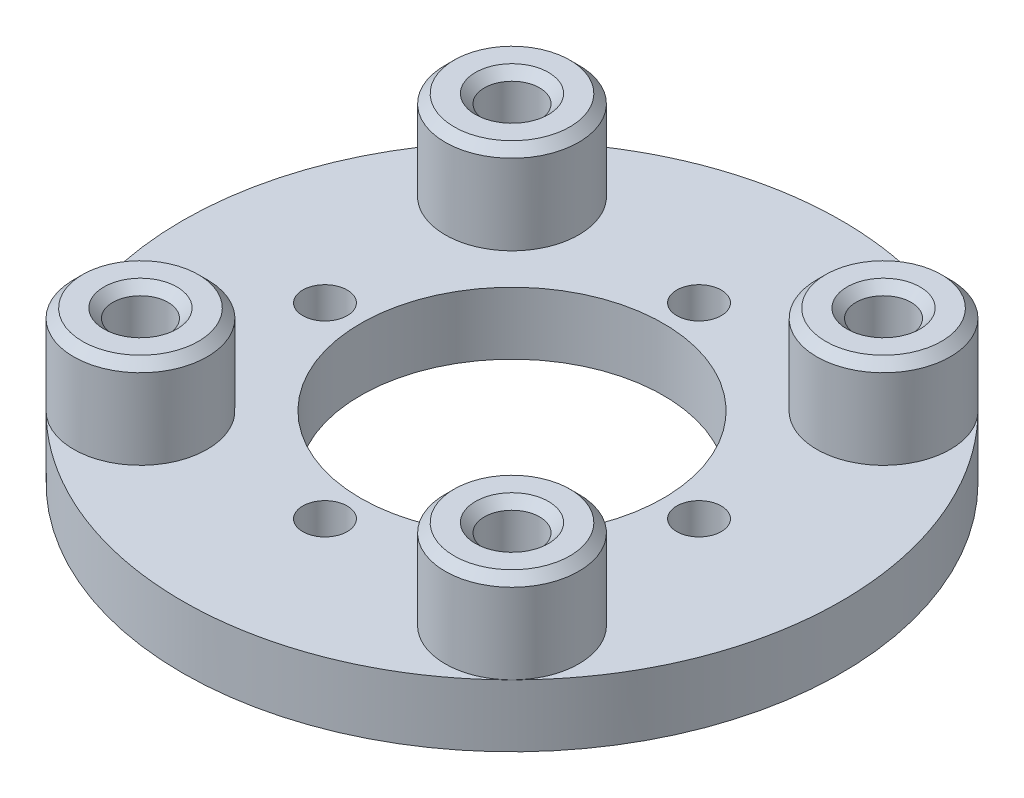
ISO-10303-21;
HEADER;
FILE_DESCRIPTION(('STEP AP214'),'2;1');
FILE_NAME('part.step','',(''),(''),'','','');
FILE_SCHEMA(('AUTOMOTIVE_DESIGN { 1 0 10303 214 1 1 1 1 }'));
ENDSEC;
DATA;
#1=APPLICATION_CONTEXT('core data for automotive mechanical design processes');
#2=APPLICATION_PROTOCOL_DEFINITION('international standard','automotive_design',2000,#1);
#3=PRODUCT_CONTEXT('',#1,'mechanical');
#4=PRODUCT('Part','Part','',(#3));
#5=PRODUCT_RELATED_PRODUCT_CATEGORY('part','',(#4));
#6=PRODUCT_DEFINITION_FORMATION('','',#4);
#7=PRODUCT_DEFINITION_CONTEXT('part definition',#1,'design');
#8=PRODUCT_DEFINITION('design','',#6,#7);
#9=PRODUCT_DEFINITION_SHAPE('','',#8);
#10=(LENGTH_UNIT() NAMED_UNIT(*) SI_UNIT(.MILLI.,.METRE.));
#11=(NAMED_UNIT(*) PLANE_ANGLE_UNIT() SI_UNIT($,.RADIAN.));
#12=(NAMED_UNIT(*) SI_UNIT($,.STERADIAN.) SOLID_ANGLE_UNIT());
#13=UNCERTAINTY_MEASURE_WITH_UNIT(LENGTH_MEASURE(1.E-05),#10,'distance_accuracy_value','');
#14=(GEOMETRIC_REPRESENTATION_CONTEXT(3) GLOBAL_UNCERTAINTY_ASSIGNED_CONTEXT((#13)) GLOBAL_UNIT_ASSIGNED_CONTEXT((#10,
#11,#12)) REPRESENTATION_CONTEXT('',''));
#15=CARTESIAN_POINT('',(0.,0.,0.));
#16=DIRECTION('',(0.,0.,1.));
#17=DIRECTION('',(1.,0.,0.));
#18=AXIS2_PLACEMENT_3D('',#15,#16,#17);
#19=CARTESIAN_POINT('',(0.,7.,0.));
#20=DIRECTION('',(0.,1.,0.));
#21=DIRECTION('',(0.,0.,1.));
#22=AXIS2_PLACEMENT_3D('',#19,#20,#21);
#23=PLANE('',#22);
#24=CARTESIAN_POINT('',(-21.,7.,-1.46642216231412E-13));
#25=DIRECTION('',(0.,1.,0.));
#26=DIRECTION('',(0.,0.,1.));
#27=AXIS2_PLACEMENT_3D('',#24,#25,#26);
#28=CIRCLE('',#27,2.5);
#29=CARTESIAN_POINT('',(-21.,7.,2.49999999999985));
#30=VERTEX_POINT('',#29);
#31=EDGE_CURVE('E432',#30,#30,#28,.T.);
#32=ORIENTED_EDGE('',*,*,#31,.F.);
#33=EDGE_LOOP('',(#32));
#34=FACE_BOUND('',#33,.T.);
#35=CARTESIAN_POINT('',(0.,7.,0.));
#36=DIRECTION('',(0.,1.,0.));
#37=DIRECTION('',(0.,0.,1.));
#38=AXIS2_PLACEMENT_3D('',#35,#36,#37);
#39=CIRCLE('',#38,17.);
#40=CARTESIAN_POINT('',(0.,7.,17.));
#41=VERTEX_POINT('',#40);
#42=EDGE_CURVE('E396',#41,#41,#39,.T.);
#43=ORIENTED_EDGE('',*,*,#42,.F.);
#44=EDGE_LOOP('',(#43));
#45=FACE_BOUND('',#44,.T.);
#46=CARTESIAN_POINT('',(0.,7.,0.));
#47=DIRECTION('',(0.,1.,0.));
#48=DIRECTION('',(0.,0.,1.));
#49=AXIS2_PLACEMENT_3D('',#46,#47,#48);
#50=CIRCLE('',#49,37.);
#51=CARTESIAN_POINT('',(26.1629509039023,7.,26.1629509039023));
#52=VERTEX_POINT('',#51);
#53=CARTESIAN_POINT('',(26.1629509039025,7.,-26.162950903902));
#54=VERTEX_POINT('',#53);
#55=EDGE_CURVE('E77',#52,#54,#50,.T.);
#56=ORIENTED_EDGE('',*,*,#55,.T.);
#57=CARTESIAN_POINT('',(20.8596500450034,7.,-20.8596500450029));
#58=DIRECTION('',(0.,1.,0.));
#59=DIRECTION('',(0.,0.,1.));
#60=AXIS2_PLACEMENT_3D('',#57,#58,#59);
#61=CIRCLE('',#60,7.5);
#62=EDGE_CURVE('E48',#54,#54,#61,.T.);
#63=ORIENTED_EDGE('',*,*,#62,.F.);
#64=CARTESIAN_POINT('',(-26.1629509039021,7.,-26.1629509039024));
#65=VERTEX_POINT('',#64);
#66=EDGE_CURVE('E54',#54,#65,#50,.T.);
#67=ORIENTED_EDGE('',*,*,#66,.T.);
#68=CARTESIAN_POINT('',(-20.859650045003,7.,-20.8596500450033));
#69=DIRECTION('',(0.,1.,0.));
#70=DIRECTION('',(0.,0.,1.));
#71=AXIS2_PLACEMENT_3D('',#68,#69,#70);
#72=CIRCLE('',#71,7.5);
#73=EDGE_CURVE('E438',#65,#65,#72,.T.);
#74=ORIENTED_EDGE('',*,*,#73,.F.);
#75=CARTESIAN_POINT('',(-26.1629509039023,7.,26.1629509039022));
#76=VERTEX_POINT('',#75);
#77=EDGE_CURVE('E74',#65,#76,#50,.T.);
#78=ORIENTED_EDGE('',*,*,#77,.T.);
#79=CARTESIAN_POINT('',(-20.8596500450032,7.,20.8596500450031));
#80=DIRECTION('',(0.,1.,0.));
#81=DIRECTION('',(0.,0.,1.));
#82=AXIS2_PLACEMENT_3D('',#79,#80,#81);
#83=CIRCLE('',#82,7.5);
#84=EDGE_CURVE('E71',#76,#76,#83,.T.);
#85=ORIENTED_EDGE('',*,*,#84,.F.);
#86=EDGE_CURVE('E64',#76,#52,#50,.T.);
#87=ORIENTED_EDGE('',*,*,#86,.T.);
#88=CARTESIAN_POINT('',(20.8596500450031,7.,20.8596500450031));
#89=DIRECTION('',(0.,1.,0.));
#90=DIRECTION('',(0.,0.,1.));
#91=AXIS2_PLACEMENT_3D('',#88,#89,#90);
#92=CIRCLE('',#91,7.5);
#93=EDGE_CURVE('E69',#52,#52,#92,.T.);
#94=ORIENTED_EDGE('',*,*,#93,.F.);
#95=EDGE_LOOP('',(#56,#63,#67,#74,#78,#85,#87,#94));
#96=FACE_BOUND('',#95,.T.);
#97=CARTESIAN_POINT('',(21.,7.,0.));
#98=DIRECTION('',(0.,1.,0.));
#99=DIRECTION('',(0.,0.,1.));
#100=AXIS2_PLACEMENT_3D('',#97,#98,#99);
#101=CIRCLE('',#100,2.5);
#102=CARTESIAN_POINT('',(21.,7.,2.5));
#103=VERTEX_POINT('',#102);
#104=EDGE_CURVE('E89',#103,#103,#101,.T.);
#105=ORIENTED_EDGE('',*,*,#104,.F.);
#106=EDGE_LOOP('',(#105));
#107=FACE_BOUND('',#106,.T.);
#108=CARTESIAN_POINT('',(0.,7.,21.));
#109=DIRECTION('',(0.,1.,0.));
#110=DIRECTION('',(0.,0.,1.));
#111=AXIS2_PLACEMENT_3D('',#108,#109,#110);
#112=CIRCLE('',#111,2.5);
#113=CARTESIAN_POINT('',(0.,7.,23.5));
#114=VERTEX_POINT('',#113);
#115=EDGE_CURVE('E401',#114,#114,#112,.T.);
#116=ORIENTED_EDGE('',*,*,#115,.F.);
#117=EDGE_LOOP('',(#116));
#118=FACE_BOUND('',#117,.T.);
#119=CARTESIAN_POINT('',(2.19963324347117E-13,7.,-21.));
#120=DIRECTION('',(0.,1.,0.));
#121=DIRECTION('',(0.,0.,1.));
#122=AXIS2_PLACEMENT_3D('',#119,#120,#121);
#123=CIRCLE('',#122,2.5);
#124=CARTESIAN_POINT('',(2.19963324347117E-13,7.,-18.5));
#125=VERTEX_POINT('',#124);
#126=EDGE_CURVE('E426',#125,#125,#123,.T.);
#127=ORIENTED_EDGE('',*,*,#126,.F.);
#128=EDGE_LOOP('',(#127));
#129=FACE_BOUND('',#128,.T.);
#130=ADVANCED_FACE('F35',(#34,#45,#96,#107,#118,#129),#23,.T.);
#131=CARTESIAN_POINT('',(0.,0.,0.));
#132=DIRECTION('',(0.,1.,0.));
#133=DIRECTION('',(0.,0.,1.));
#134=AXIS2_PLACEMENT_3D('',#131,#132,#133);
#135=PLANE('',#134);
#136=CARTESIAN_POINT('',(20.8596500450043,0.,-20.8596500450032));
#137=DIRECTION('',(0.,1.,0.));
#138=DIRECTION('',(0.,0.,1.));
#139=AXIS2_PLACEMENT_3D('',#136,#137,#138);
#140=CIRCLE('',#139,4.09999999999972);
#141=CARTESIAN_POINT('',(20.8596500450043,0.,-16.7596500450034));
#142=VERTEX_POINT('',#141);
#143=EDGE_CURVE('E102',#142,#142,#140,.T.);
#144=ORIENTED_EDGE('',*,*,#143,.T.);
#145=EDGE_LOOP('',(#144));
#146=FACE_BOUND('',#145,.T.);
#147=CARTESIAN_POINT('',(-20.859650045002,0.,-20.8596500450043));
#148=DIRECTION('',(0.,1.,0.));
#149=DIRECTION('',(0.,0.,1.));
#150=AXIS2_PLACEMENT_3D('',#147,#148,#149);
#151=CIRCLE('',#150,4.10000000000084);
#152=CARTESIAN_POINT('',(-20.859650045002,0.,-16.7596500450035));
#153=VERTEX_POINT('',#152);
#154=EDGE_CURVE('E99',#153,#153,#151,.T.);
#155=ORIENTED_EDGE('',*,*,#154,.T.);
#156=EDGE_LOOP('',(#155));
#157=FACE_BOUND('',#156,.T.);
#158=CARTESIAN_POINT('',(-20.8596500450032,0.,20.859650045002));
#159=DIRECTION('',(0.,1.,0.));
#160=DIRECTION('',(0.,0.,1.));
#161=AXIS2_PLACEMENT_3D('',#158,#159,#160);
#162=CIRCLE('',#161,4.10000000000124);
#163=CARTESIAN_POINT('',(-20.8596500450032,0.,24.9596500450032));
#164=VERTEX_POINT('',#163);
#165=EDGE_CURVE('E96',#164,#164,#162,.T.);
#166=ORIENTED_EDGE('',*,*,#165,.T.);
#167=EDGE_LOOP('',(#166));
#168=FACE_BOUND('',#167,.T.);
#169=CARTESIAN_POINT('',(20.8596500450031,0.,20.8596500450031));
#170=DIRECTION('',(0.,1.,0.));
#171=DIRECTION('',(0.,0.,1.));
#172=AXIS2_PLACEMENT_3D('',#169,#170,#171);
#173=CIRCLE('',#172,4.09999999999999);
#174=CARTESIAN_POINT('',(20.8596500450031,0.,24.9596500450031));
#175=VERTEX_POINT('',#174);
#176=EDGE_CURVE('E93',#175,#175,#173,.T.);
#177=ORIENTED_EDGE('',*,*,#176,.T.);
#178=EDGE_LOOP('',(#177));
#179=FACE_BOUND('',#178,.T.);
#180=CARTESIAN_POINT('',(0.,0.,0.));
#181=DIRECTION('',(0.,1.,0.));
#182=DIRECTION('',(0.,0.,1.));
#183=AXIS2_PLACEMENT_3D('',#180,#181,#182);
#184=CIRCLE('',#183,37.);
#185=CARTESIAN_POINT('',(0.,0.,37.));
#186=VERTEX_POINT('',#185);
#187=EDGE_CURVE('E75',#186,#186,#184,.T.);
#188=ORIENTED_EDGE('',*,*,#187,.F.);
#189=EDGE_LOOP('',(#188));
#190=FACE_BOUND('',#189,.T.);
#191=CARTESIAN_POINT('',(21.,0.,0.));
#192=DIRECTION('',(0.,1.,0.));
#193=DIRECTION('',(0.,0.,1.));
#194=AXIS2_PLACEMENT_3D('',#191,#192,#193);
#195=CIRCLE('',#194,2.5);
#196=CARTESIAN_POINT('',(21.,0.,2.5));
#197=VERTEX_POINT('',#196);
#198=EDGE_CURVE('E86',#197,#197,#195,.T.);
#199=ORIENTED_EDGE('',*,*,#198,.T.);
#200=EDGE_LOOP('',(#199));
#201=FACE_BOUND('',#200,.T.);
#202=CARTESIAN_POINT('',(0.,0.,0.));
#203=DIRECTION('',(0.,1.,0.));
#204=DIRECTION('',(0.,0.,1.));
#205=AXIS2_PLACEMENT_3D('',#202,#203,#204);
#206=CIRCLE('',#205,17.);
#207=CARTESIAN_POINT('',(0.,0.,17.));
#208=VERTEX_POINT('',#207);
#209=EDGE_CURVE('E399',#208,#208,#206,.T.);
#210=ORIENTED_EDGE('',*,*,#209,.T.);
#211=EDGE_LOOP('',(#210));
#212=FACE_BOUND('',#211,.T.);
#213=CARTESIAN_POINT('',(0.,0.,21.));
#214=DIRECTION('',(0.,1.,0.));
#215=DIRECTION('',(0.,0.,1.));
#216=AXIS2_PLACEMENT_3D('',#213,#214,#215);
#217=CIRCLE('',#216,2.5);
#218=CARTESIAN_POINT('',(0.,0.,23.5));
#219=VERTEX_POINT('',#218);
#220=EDGE_CURVE('E405',#219,#219,#217,.T.);
#221=ORIENTED_EDGE('',*,*,#220,.T.);
#222=EDGE_LOOP('',(#221));
#223=FACE_BOUND('',#222,.T.);
#224=CARTESIAN_POINT('',(-21.,0.,-1.46642216231412E-13));
#225=DIRECTION('',(0.,1.,0.));
#226=DIRECTION('',(0.,0.,1.));
#227=AXIS2_PLACEMENT_3D('',#224,#225,#226);
#228=CIRCLE('',#227,2.5);
#229=CARTESIAN_POINT('',(-21.,0.,2.49999999999985));
#230=VERTEX_POINT('',#229);
#231=EDGE_CURVE('E421',#230,#230,#228,.T.);
#232=ORIENTED_EDGE('',*,*,#231,.T.);
#233=EDGE_LOOP('',(#232));
#234=FACE_BOUND('',#233,.T.);
#235=CARTESIAN_POINT('',(2.19963324347117E-13,0.,-21.));
#236=DIRECTION('',(0.,1.,0.));
#237=DIRECTION('',(0.,0.,1.));
#238=AXIS2_PLACEMENT_3D('',#235,#236,#237);
#239=CIRCLE('',#238,2.5);
#240=CARTESIAN_POINT('',(2.19963324347117E-13,0.,-18.5));
#241=VERTEX_POINT('',#240);
#242=EDGE_CURVE('E424',#241,#241,#239,.T.);
#243=ORIENTED_EDGE('',*,*,#242,.T.);
#244=EDGE_LOOP('',(#243));
#245=FACE_BOUND('',#244,.T.);
#246=ADVANCED_FACE('F179',(#146,#157,#168,#179,#190,#201,#212,#223,#234,#245),#135,.F.);
#247=CARTESIAN_POINT('',(0.,7.,0.));
#248=DIRECTION('',(0.,-1.,0.));
#249=DIRECTION('',(0.,0.,-1.));
#250=AXIS2_PLACEMENT_3D('',#247,#248,#249);
#251=CYLINDRICAL_SURFACE('',#250,37.);
#252=ORIENTED_EDGE('',*,*,#55,.F.);
#253=ORIENTED_EDGE('',*,*,#86,.F.);
#254=ORIENTED_EDGE('',*,*,#77,.F.);
#255=ORIENTED_EDGE('',*,*,#66,.F.);
#256=EDGE_LOOP('',(#252,#253,#254,#255));
#257=FACE_BOUND('',#256,.T.);
#258=ORIENTED_EDGE('',*,*,#187,.T.);
#259=EDGE_LOOP('',(#258));
#260=FACE_BOUND('',#259,.T.);
#261=ADVANCED_FACE('F78',(#257,#260),#251,.T.);
#262=CARTESIAN_POINT('',(21.,7.,0.));
#263=DIRECTION('',(0.,-1.,0.));
#264=DIRECTION('',(0.,0.,-1.));
#265=AXIS2_PLACEMENT_3D('',#262,#263,#264);
#266=CYLINDRICAL_SURFACE('',#265,2.5);
#267=ORIENTED_EDGE('',*,*,#104,.T.);
#268=EDGE_LOOP('',(#267));
#269=FACE_BOUND('',#268,.T.);
#270=ORIENTED_EDGE('',*,*,#198,.F.);
#271=EDGE_LOOP('',(#270));
#272=FACE_BOUND('',#271,.T.);
#273=ADVANCED_FACE('F191',(#269,#272),#266,.F.);
#274=CARTESIAN_POINT('',(0.,7.,0.));
#275=DIRECTION('',(0.,-1.,0.));
#276=DIRECTION('',(0.,0.,-1.));
#277=AXIS2_PLACEMENT_3D('',#274,#275,#276);
#278=CYLINDRICAL_SURFACE('',#277,17.);
#279=ORIENTED_EDGE('',*,*,#42,.T.);
#280=EDGE_LOOP('',(#279));
#281=FACE_BOUND('',#280,.T.);
#282=ORIENTED_EDGE('',*,*,#209,.F.);
#283=EDGE_LOOP('',(#282));
#284=FACE_BOUND('',#283,.T.);
#285=ADVANCED_FACE('F385',(#281,#284),#278,.F.);
#286=CARTESIAN_POINT('',(0.,7.,21.));
#287=DIRECTION('',(0.,-1.,0.));
#288=DIRECTION('',(0.,0.,-1.));
#289=AXIS2_PLACEMENT_3D('',#286,#287,#288);
#290=CYLINDRICAL_SURFACE('',#289,2.5);
#291=ORIENTED_EDGE('',*,*,#115,.T.);
#292=EDGE_LOOP('',(#291));
#293=FACE_BOUND('',#292,.T.);
#294=ORIENTED_EDGE('',*,*,#220,.F.);
#295=EDGE_LOOP('',(#294));
#296=FACE_BOUND('',#295,.T.);
#297=ADVANCED_FACE('F382',(#293,#296),#290,.F.);
#298=CARTESIAN_POINT('',(-21.,7.,-1.46642216231412E-13));
#299=DIRECTION('',(0.,-1.,0.));
#300=DIRECTION('',(0.,0.,-1.));
#301=AXIS2_PLACEMENT_3D('',#298,#299,#300);
#302=CYLINDRICAL_SURFACE('',#301,2.5);
#303=ORIENTED_EDGE('',*,*,#31,.T.);
#304=EDGE_LOOP('',(#303));
#305=FACE_BOUND('',#304,.T.);
#306=ORIENTED_EDGE('',*,*,#231,.F.);
#307=EDGE_LOOP('',(#306));
#308=FACE_BOUND('',#307,.T.);
#309=ADVANCED_FACE('F378',(#305,#308),#302,.F.);
#310=CARTESIAN_POINT('',(2.19963324347117E-13,7.,-21.));
#311=DIRECTION('',(0.,-1.,0.));
#312=DIRECTION('',(0.,0.,-1.));
#313=AXIS2_PLACEMENT_3D('',#310,#311,#312);
#314=CYLINDRICAL_SURFACE('',#313,2.5);
#315=ORIENTED_EDGE('',*,*,#126,.T.);
#316=EDGE_LOOP('',(#315));
#317=FACE_BOUND('',#316,.T.);
#318=ORIENTED_EDGE('',*,*,#242,.F.);
#319=EDGE_LOOP('',(#318));
#320=FACE_BOUND('',#319,.T.);
#321=ADVANCED_FACE('F374',(#317,#320),#314,.F.);
#322=CARTESIAN_POINT('',(20.8596500450031,17.,20.8596500450031));
#323=DIRECTION('',(0.,-1.,0.));
#324=DIRECTION('',(0.,0.,-1.));
#325=AXIS2_PLACEMENT_3D('',#322,#323,#324);
#326=CYLINDRICAL_SURFACE('',#325,7.5);
#327=CARTESIAN_POINT('',(20.8596500450031,16.,20.8596500450031));
#328=DIRECTION('',(0.,1.,0.));
#329=DIRECTION('',(0.,0.,1.));
#330=AXIS2_PLACEMENT_3D('',#327,#328,#329);
#331=CIRCLE('',#330,7.5);
#332=CARTESIAN_POINT('',(20.8596500450031,16.,28.3596500450031));
#333=VERTEX_POINT('',#332);
#334=EDGE_CURVE('E147',#333,#333,#331,.F.);
#335=ORIENTED_EDGE('',*,*,#334,.T.);
#336=EDGE_LOOP('',(#335));
#337=FACE_BOUND('',#336,.T.);
#338=ORIENTED_EDGE('',*,*,#93,.T.);
#339=EDGE_LOOP('',(#338));
#340=FACE_BOUND('',#339,.T.);
#341=ADVANCED_FACE('F370',(#337,#340),#326,.T.);
#342=CARTESIAN_POINT('',(20.8596500450031,17.,20.8596500450031));
#343=DIRECTION('',(0.,1.,0.));
#344=DIRECTION('',(0.,0.,1.));
#345=AXIS2_PLACEMENT_3D('',#342,#343,#344);
#346=PLANE('',#345);
#347=CARTESIAN_POINT('',(20.8596500450031,17.,20.8596500450031));
#348=DIRECTION('',(0.,1.,0.));
#349=DIRECTION('',(0.,0.,1.));
#350=AXIS2_PLACEMENT_3D('',#347,#348,#349);
#351=CIRCLE('',#350,4.09999999999998);
#352=CARTESIAN_POINT('',(20.8596500450031,17.,24.9596500450031));
#353=VERTEX_POINT('',#352);
#354=EDGE_CURVE('E144',#353,#353,#351,.F.);
#355=ORIENTED_EDGE('',*,*,#354,.T.);
#356=EDGE_LOOP('',(#355));
#357=FACE_BOUND('',#356,.T.);
#358=CARTESIAN_POINT('',(20.8596500450031,17.,20.8596500450031));
#359=DIRECTION('',(0.,1.,0.));
#360=DIRECTION('',(0.,0.,1.));
#361=AXIS2_PLACEMENT_3D('',#358,#359,#360);
#362=CIRCLE('',#361,6.50000000000001);
#363=CARTESIAN_POINT('',(20.8596500450031,17.,27.3596500450032));
#364=VERTEX_POINT('',#363);
#365=EDGE_CURVE('E141',#364,#364,#362,.T.);
#366=ORIENTED_EDGE('',*,*,#365,.T.);
#367=EDGE_LOOP('',(#366));
#368=FACE_BOUND('',#367,.T.);
#369=ADVANCED_FACE('F364',(#357,#368),#346,.T.);
#370=CARTESIAN_POINT('',(-20.8596500450032,17.,20.8596500450031));
#371=DIRECTION('',(0.,-1.,0.));
#372=DIRECTION('',(0.,0.,-1.));
#373=AXIS2_PLACEMENT_3D('',#370,#371,#372);
#374=CYLINDRICAL_SURFACE('',#373,7.5);
#375=CARTESIAN_POINT('',(-20.8596500450032,16.,20.8596500450031));
#376=DIRECTION('',(0.,1.,0.));
#377=DIRECTION('',(0.,0.,1.));
#378=AXIS2_PLACEMENT_3D('',#375,#376,#377);
#379=CIRCLE('',#378,7.5);
#380=CARTESIAN_POINT('',(-20.8596500450032,16.,28.3596500450031));
#381=VERTEX_POINT('',#380);
#382=EDGE_CURVE('E11',#381,#381,#379,.F.);
#383=ORIENTED_EDGE('',*,*,#382,.T.);
#384=EDGE_LOOP('',(#383));
#385=FACE_BOUND('',#384,.T.);
#386=ORIENTED_EDGE('',*,*,#84,.T.);
#387=EDGE_LOOP('',(#386));
#388=FACE_BOUND('',#387,.T.);
#389=ADVANCED_FACE('F358',(#385,#388),#374,.T.);
#390=CARTESIAN_POINT('',(-20.8596500450032,17.,20.8596500450031));
#391=DIRECTION('',(0.,1.,0.));
#392=DIRECTION('',(0.,0.,1.));
#393=AXIS2_PLACEMENT_3D('',#390,#391,#392);
#394=PLANE('',#393);
#395=CARTESIAN_POINT('',(-20.8596500450032,17.,20.859650045002));
#396=DIRECTION('',(0.,1.,0.));
#397=DIRECTION('',(0.,0.,1.));
#398=AXIS2_PLACEMENT_3D('',#395,#396,#397);
#399=CIRCLE('',#398,4.10000000000124);
#400=CARTESIAN_POINT('',(-20.8596500450032,17.,24.9596500450032));
#401=VERTEX_POINT('',#400);
#402=EDGE_CURVE('E138',#401,#401,#399,.F.);
#403=ORIENTED_EDGE('',*,*,#402,.T.);
#404=EDGE_LOOP('',(#403));
#405=FACE_BOUND('',#404,.T.);
#406=CARTESIAN_POINT('',(-20.8596500450032,17.,20.8596500450031));
#407=DIRECTION('',(0.,1.,0.));
#408=DIRECTION('',(0.,0.,1.));
#409=AXIS2_PLACEMENT_3D('',#406,#407,#408);
#410=CIRCLE('',#409,6.50000000000001);
#411=CARTESIAN_POINT('',(-20.8596500450032,17.,27.3596500450031));
#412=VERTEX_POINT('',#411);
#413=EDGE_CURVE('E135',#412,#412,#410,.T.);
#414=ORIENTED_EDGE('',*,*,#413,.T.);
#415=EDGE_LOOP('',(#414));
#416=FACE_BOUND('',#415,.T.);
#417=ADVANCED_FACE('F176',(#405,#416),#394,.T.);
#418=CARTESIAN_POINT('',(-20.859650045003,17.,-20.8596500450033));
#419=DIRECTION('',(0.,-1.,0.));
#420=DIRECTION('',(0.,0.,-1.));
#421=AXIS2_PLACEMENT_3D('',#418,#419,#420);
#422=CYLINDRICAL_SURFACE('',#421,7.5);
#423=CARTESIAN_POINT('',(-20.859650045003,16.,-20.8596500450033));
#424=DIRECTION('',(0.,1.,0.));
#425=DIRECTION('',(0.,0.,1.));
#426=AXIS2_PLACEMENT_3D('',#423,#424,#425);
#427=CIRCLE('',#426,7.5);
#428=CARTESIAN_POINT('',(-20.859650045003,16.,-13.3596500450033));
#429=VERTEX_POINT('',#428);
#430=EDGE_CURVE('E43',#429,#429,#427,.F.);
#431=ORIENTED_EDGE('',*,*,#430,.T.);
#432=EDGE_LOOP('',(#431));
#433=FACE_BOUND('',#432,.T.);
#434=ORIENTED_EDGE('',*,*,#73,.T.);
#435=EDGE_LOOP('',(#434));
#436=FACE_BOUND('',#435,.T.);
#437=ADVANCED_FACE('F155',(#433,#436),#422,.T.);
#438=CARTESIAN_POINT('',(-20.859650045003,17.,-20.8596500450033));
#439=DIRECTION('',(0.,1.,0.));
#440=DIRECTION('',(0.,0.,1.));
#441=AXIS2_PLACEMENT_3D('',#438,#439,#440);
#442=PLANE('',#441);
#443=CARTESIAN_POINT('',(-20.859650045002,17.,-20.8596500450043));
#444=DIRECTION('',(0.,1.,0.));
#445=DIRECTION('',(0.,0.,1.));
#446=AXIS2_PLACEMENT_3D('',#443,#444,#445);
#447=CIRCLE('',#446,4.10000000000085);
#448=CARTESIAN_POINT('',(-20.859650045002,17.,-16.7596500450035));
#449=VERTEX_POINT('',#448);
#450=EDGE_CURVE('E132',#449,#449,#447,.F.);
#451=ORIENTED_EDGE('',*,*,#450,.T.);
#452=EDGE_LOOP('',(#451));
#453=FACE_BOUND('',#452,.T.);
#454=CARTESIAN_POINT('',(-20.859650045003,17.,-20.8596500450033));
#455=DIRECTION('',(0.,1.,0.));
#456=DIRECTION('',(0.,0.,1.));
#457=AXIS2_PLACEMENT_3D('',#454,#455,#456);
#458=CIRCLE('',#457,6.50000000000001);
#459=CARTESIAN_POINT('',(-20.859650045003,17.,-14.3596500450033));
#460=VERTEX_POINT('',#459);
#461=EDGE_CURVE('E129',#460,#460,#458,.T.);
#462=ORIENTED_EDGE('',*,*,#461,.T.);
#463=EDGE_LOOP('',(#462));
#464=FACE_BOUND('',#463,.T.);
#465=ADVANCED_FACE('F164',(#453,#464),#442,.T.);
#466=CARTESIAN_POINT('',(20.8596500450034,17.,-20.8596500450029));
#467=DIRECTION('',(0.,-1.,0.));
#468=DIRECTION('',(0.,0.,-1.));
#469=AXIS2_PLACEMENT_3D('',#466,#467,#468);
#470=CYLINDRICAL_SURFACE('',#469,7.5);
#471=CARTESIAN_POINT('',(20.8596500450034,16.,-20.8596500450029));
#472=DIRECTION('',(0.,1.,0.));
#473=DIRECTION('',(0.,0.,1.));
#474=AXIS2_PLACEMENT_3D('',#471,#472,#473);
#475=CIRCLE('',#474,7.5);
#476=CARTESIAN_POINT('',(20.8596500450034,16.,-13.3596500450029));
#477=VERTEX_POINT('',#476);
#478=EDGE_CURVE('E150',#477,#477,#475,.F.);
#479=ORIENTED_EDGE('',*,*,#478,.T.);
#480=EDGE_LOOP('',(#479));
#481=FACE_BOUND('',#480,.T.);
#482=ORIENTED_EDGE('',*,*,#62,.T.);
#483=EDGE_LOOP('',(#482));
#484=FACE_BOUND('',#483,.T.);
#485=ADVANCED_FACE('F166',(#481,#484),#470,.T.);
#486=CARTESIAN_POINT('',(20.8596500450034,17.,-20.8596500450029));
#487=DIRECTION('',(0.,1.,0.));
#488=DIRECTION('',(0.,0.,1.));
#489=AXIS2_PLACEMENT_3D('',#486,#487,#488);
#490=PLANE('',#489);
#491=CARTESIAN_POINT('',(20.8596500450043,17.,-20.8596500450032));
#492=DIRECTION('',(0.,1.,0.));
#493=DIRECTION('',(0.,0.,1.));
#494=AXIS2_PLACEMENT_3D('',#491,#492,#493);
#495=CIRCLE('',#494,4.0999999999997);
#496=CARTESIAN_POINT('',(20.8596500450043,17.,-16.7596500450035));
#497=VERTEX_POINT('',#496);
#498=EDGE_CURVE('E126',#497,#497,#495,.F.);
#499=ORIENTED_EDGE('',*,*,#498,.T.);
#500=EDGE_LOOP('',(#499));
#501=FACE_BOUND('',#500,.T.);
#502=CARTESIAN_POINT('',(20.8596500450034,17.,-20.8596500450029));
#503=DIRECTION('',(0.,1.,0.));
#504=DIRECTION('',(0.,0.,1.));
#505=AXIS2_PLACEMENT_3D('',#502,#503,#504);
#506=CIRCLE('',#505,6.50000000000001);
#507=CARTESIAN_POINT('',(20.8596500450034,17.,-14.3596500450029));
#508=VERTEX_POINT('',#507);
#509=EDGE_CURVE('E123',#508,#508,#506,.T.);
#510=ORIENTED_EDGE('',*,*,#509,.T.);
#511=EDGE_LOOP('',(#510));
#512=FACE_BOUND('',#511,.T.);
#513=ADVANCED_FACE('F173',(#501,#512),#490,.T.);
#514=CARTESIAN_POINT('',(20.8596500450043,17.001,-20.8596500450032));
#515=DIRECTION('',(0.,-1.,0.));
#516=DIRECTION('',(0.,0.,-1.));
#517=AXIS2_PLACEMENT_3D('',#514,#515,#516);
#518=CYLINDRICAL_SURFACE('',#517,3.0999999999997);
#519=CARTESIAN_POINT('',(20.8596500450043,0.999999999999997,-20.8596500450032));
#520=DIRECTION('',(0.,1.,0.));
#521=DIRECTION('',(0.,0.,1.));
#522=AXIS2_PLACEMENT_3D('',#519,#520,#521);
#523=CIRCLE('',#522,3.0999999999997);
#524=CARTESIAN_POINT('',(20.8596500450043,0.999999999999997,-17.7596500450035));
#525=VERTEX_POINT('',#524);
#526=EDGE_CURVE('E82',#525,#525,#523,.F.);
#527=ORIENTED_EDGE('',*,*,#526,.T.);
#528=EDGE_LOOP('',(#527));
#529=FACE_BOUND('',#528,.T.);
#530=CARTESIAN_POINT('',(20.8596500450043,16.,-20.8596500450032));
#531=DIRECTION('',(0.,1.,0.));
#532=DIRECTION('',(0.,0.,1.));
#533=AXIS2_PLACEMENT_3D('',#530,#531,#532);
#534=CIRCLE('',#533,3.0999999999997);
#535=CARTESIAN_POINT('',(20.8596500450043,16.,-17.7596500450035));
#536=VERTEX_POINT('',#535);
#537=EDGE_CURVE('E80',#536,#536,#534,.T.);
#538=ORIENTED_EDGE('',*,*,#537,.T.);
#539=EDGE_LOOP('',(#538));
#540=FACE_BOUND('',#539,.T.);
#541=ADVANCED_FACE('F242',(#529,#540),#518,.F.);
#542=CARTESIAN_POINT('',(-20.859650045002,17.001,-20.8596500450043));
#543=DIRECTION('',(0.,-1.,0.));
#544=DIRECTION('',(0.,0.,-1.));
#545=AXIS2_PLACEMENT_3D('',#542,#543,#544);
#546=CYLINDRICAL_SURFACE('',#545,3.10000000000086);
#547=CARTESIAN_POINT('',(-20.859650045002,0.999999999999977,-20.8596500450043));
#548=DIRECTION('',(0.,1.,0.));
#549=DIRECTION('',(0.,0.,1.));
#550=AXIS2_PLACEMENT_3D('',#547,#548,#549);
#551=CIRCLE('',#550,3.10000000000086);
#552=CARTESIAN_POINT('',(-20.859650045002,0.999999999999977,-17.7596500450035));
#553=VERTEX_POINT('',#552);
#554=EDGE_CURVE('E108',#553,#553,#551,.F.);
#555=ORIENTED_EDGE('',*,*,#554,.T.);
#556=EDGE_LOOP('',(#555));
#557=FACE_BOUND('',#556,.T.);
#558=CARTESIAN_POINT('',(-20.859650045002,16.,-20.8596500450043));
#559=DIRECTION('',(0.,1.,0.));
#560=DIRECTION('',(0.,0.,1.));
#561=AXIS2_PLACEMENT_3D('',#558,#559,#560);
#562=CIRCLE('',#561,3.10000000000086);
#563=CARTESIAN_POINT('',(-20.859650045002,16.,-17.7596500450035));
#564=VERTEX_POINT('',#563);
#565=EDGE_CURVE('E105',#564,#564,#562,.T.);
#566=ORIENTED_EDGE('',*,*,#565,.T.);
#567=EDGE_LOOP('',(#566));
#568=FACE_BOUND('',#567,.T.);
#569=ADVANCED_FACE('F248',(#557,#568),#546,.F.);
#570=CARTESIAN_POINT('',(-20.8596500450032,17.001,20.859650045002));
#571=DIRECTION('',(0.,-1.,0.));
#572=DIRECTION('',(0.,0.,-1.));
#573=AXIS2_PLACEMENT_3D('',#570,#571,#572);
#574=CYLINDRICAL_SURFACE('',#573,3.10000000000125);
#575=CARTESIAN_POINT('',(-20.8596500450032,1.,20.859650045002));
#576=DIRECTION('',(0.,1.,0.));
#577=DIRECTION('',(0.,0.,1.));
#578=AXIS2_PLACEMENT_3D('',#575,#576,#577);
#579=CIRCLE('',#578,3.10000000000125);
#580=CARTESIAN_POINT('',(-20.8596500450032,1.,23.9596500450032));
#581=VERTEX_POINT('',#580);
#582=EDGE_CURVE('E114',#581,#581,#579,.F.);
#583=ORIENTED_EDGE('',*,*,#582,.T.);
#584=EDGE_LOOP('',(#583));
#585=FACE_BOUND('',#584,.T.);
#586=CARTESIAN_POINT('',(-20.8596500450032,16.,20.859650045002));
#587=DIRECTION('',(0.,1.,0.));
#588=DIRECTION('',(0.,0.,1.));
#589=AXIS2_PLACEMENT_3D('',#586,#587,#588);
#590=CIRCLE('',#589,3.10000000000125);
#591=CARTESIAN_POINT('',(-20.8596500450032,16.,23.9596500450032));
#592=VERTEX_POINT('',#591);
#593=EDGE_CURVE('E111',#592,#592,#590,.T.);
#594=ORIENTED_EDGE('',*,*,#593,.T.);
#595=EDGE_LOOP('',(#594));
#596=FACE_BOUND('',#595,.T.);
#597=ADVANCED_FACE('F254',(#585,#596),#574,.F.);
#598=CARTESIAN_POINT('',(20.8596500450031,17.001,20.8596500450031));
#599=DIRECTION('',(0.,-1.,0.));
#600=DIRECTION('',(0.,0.,-1.));
#601=AXIS2_PLACEMENT_3D('',#598,#599,#600);
#602=CYLINDRICAL_SURFACE('',#601,3.1);
#603=CARTESIAN_POINT('',(20.8596500450031,0.99999999999999,20.8596500450031));
#604=DIRECTION('',(0.,1.,0.));
#605=DIRECTION('',(0.,0.,1.));
#606=AXIS2_PLACEMENT_3D('',#603,#604,#605);
#607=CIRCLE('',#606,3.1);
#608=CARTESIAN_POINT('',(20.8596500450031,0.99999999999999,23.9596500450031));
#609=VERTEX_POINT('',#608);
#610=EDGE_CURVE('E120',#609,#609,#607,.F.);
#611=ORIENTED_EDGE('',*,*,#610,.T.);
#612=EDGE_LOOP('',(#611));
#613=FACE_BOUND('',#612,.T.);
#614=CARTESIAN_POINT('',(20.8596500450031,16.,20.8596500450031));
#615=DIRECTION('',(0.,1.,0.));
#616=DIRECTION('',(0.,0.,1.));
#617=AXIS2_PLACEMENT_3D('',#614,#615,#616);
#618=CIRCLE('',#617,3.1);
#619=CARTESIAN_POINT('',(20.8596500450031,16.,23.9596500450031));
#620=VERTEX_POINT('',#619);
#621=EDGE_CURVE('E117',#620,#620,#618,.T.);
#622=ORIENTED_EDGE('',*,*,#621,.T.);
#623=EDGE_LOOP('',(#622));
#624=FACE_BOUND('',#623,.T.);
#625=ADVANCED_FACE('F200',(#613,#624),#602,.F.);
#626=CARTESIAN_POINT('',(20.8596500450043,0.999999999999997,-20.8596500450032));
#627=DIRECTION('',(0.,-1.,0.));
#628=DIRECTION('',(0.,0.,-1.));
#629=AXIS2_PLACEMENT_3D('',#626,#627,#628);
#630=CONICAL_SURFACE('',#629,3.0999999999997,0.785398163397457);
#631=ORIENTED_EDGE('',*,*,#143,.F.);
#632=EDGE_LOOP('',(#631));
#633=FACE_BOUND('',#632,.T.);
#634=ORIENTED_EDGE('',*,*,#526,.F.);
#635=EDGE_LOOP('',(#634));
#636=FACE_BOUND('',#635,.T.);
#637=ADVANCED_FACE('F196',(#633,#636),#630,.F.);
#638=CARTESIAN_POINT('',(-20.859650045002,0.999999999999977,-20.8596500450043));
#639=DIRECTION('',(0.,-1.,0.));
#640=DIRECTION('',(0.,0.,-1.));
#641=AXIS2_PLACEMENT_3D('',#638,#639,#640);
#642=CONICAL_SURFACE('',#641,3.10000000000086,0.78539816339745);
#643=ORIENTED_EDGE('',*,*,#154,.F.);
#644=EDGE_LOOP('',(#643));
#645=FACE_BOUND('',#644,.T.);
#646=ORIENTED_EDGE('',*,*,#554,.F.);
#647=EDGE_LOOP('',(#646));
#648=FACE_BOUND('',#647,.T.);
#649=ADVANCED_FACE('F199',(#645,#648),#642,.F.);
#650=CARTESIAN_POINT('',(-20.8596500450032,1.,20.859650045002));
#651=DIRECTION('',(0.,-1.,0.));
#652=DIRECTION('',(0.,0.,-1.));
#653=AXIS2_PLACEMENT_3D('',#650,#651,#652);
#654=CONICAL_SURFACE('',#653,3.10000000000125,0.785398163397441);
#655=ORIENTED_EDGE('',*,*,#165,.F.);
#656=EDGE_LOOP('',(#655));
#657=FACE_BOUND('',#656,.T.);
#658=ORIENTED_EDGE('',*,*,#582,.F.);
#659=EDGE_LOOP('',(#658));
#660=FACE_BOUND('',#659,.T.);
#661=ADVANCED_FACE('F204',(#657,#660),#654,.F.);
#662=CARTESIAN_POINT('',(20.8596500450031,0.99999999999999,20.8596500450031));
#663=DIRECTION('',(0.,-1.,0.));
#664=DIRECTION('',(0.,0.,-1.));
#665=AXIS2_PLACEMENT_3D('',#662,#663,#664);
#666=CONICAL_SURFACE('',#665,3.1,0.78539816339745);
#667=ORIENTED_EDGE('',*,*,#176,.F.);
#668=EDGE_LOOP('',(#667));
#669=FACE_BOUND('',#668,.T.);
#670=ORIENTED_EDGE('',*,*,#610,.F.);
#671=EDGE_LOOP('',(#670));
#672=FACE_BOUND('',#671,.T.);
#673=ADVANCED_FACE('F208',(#669,#672),#666,.F.);
#674=CARTESIAN_POINT('',(20.8596500450043,17.,-20.8596500450032));
#675=DIRECTION('',(0.,1.,0.));
#676=DIRECTION('',(0.,0.,1.));
#677=AXIS2_PLACEMENT_3D('',#674,#675,#676);
#678=CONICAL_SURFACE('',#677,4.0999999999997,0.785398163397448);
#679=ORIENTED_EDGE('',*,*,#537,.F.);
#680=EDGE_LOOP('',(#679));
#681=FACE_BOUND('',#680,.T.);
#682=ORIENTED_EDGE('',*,*,#498,.F.);
#683=EDGE_LOOP('',(#682));
#684=FACE_BOUND('',#683,.T.);
#685=ADVANCED_FACE('F212',(#681,#684),#678,.F.);
#686=CARTESIAN_POINT('',(-20.859650045002,17.,-20.8596500450043));
#687=DIRECTION('',(0.,1.,0.));
#688=DIRECTION('',(0.,0.,1.));
#689=AXIS2_PLACEMENT_3D('',#686,#687,#688);
#690=CONICAL_SURFACE('',#689,4.10000000000085,0.785398163397447);
#691=ORIENTED_EDGE('',*,*,#565,.F.);
#692=EDGE_LOOP('',(#691));
#693=FACE_BOUND('',#692,.T.);
#694=ORIENTED_EDGE('',*,*,#450,.F.);
#695=EDGE_LOOP('',(#694));
#696=FACE_BOUND('',#695,.T.);
#697=ADVANCED_FACE('F216',(#693,#696),#690,.F.);
#698=CARTESIAN_POINT('',(-20.8596500450032,17.,20.859650045002));
#699=DIRECTION('',(0.,1.,0.));
#700=DIRECTION('',(0.,0.,1.));
#701=AXIS2_PLACEMENT_3D('',#698,#699,#700);
#702=CONICAL_SURFACE('',#701,4.10000000000124,0.785398163397444);
#703=ORIENTED_EDGE('',*,*,#593,.F.);
#704=EDGE_LOOP('',(#703));
#705=FACE_BOUND('',#704,.T.);
#706=ORIENTED_EDGE('',*,*,#402,.F.);
#707=EDGE_LOOP('',(#706));
#708=FACE_BOUND('',#707,.T.);
#709=ADVANCED_FACE('F220',(#705,#708),#702,.F.);
#710=CARTESIAN_POINT('',(20.8596500450031,17.,20.8596500450031));
#711=DIRECTION('',(0.,1.,0.));
#712=DIRECTION('',(0.,0.,1.));
#713=AXIS2_PLACEMENT_3D('',#710,#711,#712);
#714=CONICAL_SURFACE('',#713,4.09999999999998,0.78539816339744);
#715=ORIENTED_EDGE('',*,*,#621,.F.);
#716=EDGE_LOOP('',(#715));
#717=FACE_BOUND('',#716,.T.);
#718=ORIENTED_EDGE('',*,*,#354,.F.);
#719=EDGE_LOOP('',(#718));
#720=FACE_BOUND('',#719,.T.);
#721=ADVANCED_FACE('F224',(#717,#720),#714,.F.);
#722=CARTESIAN_POINT('',(20.8596500450031,17.,20.8596500450031));
#723=DIRECTION('',(0.,-1.,0.));
#724=DIRECTION('',(0.,0.,-1.));
#725=AXIS2_PLACEMENT_3D('',#722,#723,#724);
#726=CONICAL_SURFACE('',#725,6.50000000000001,0.78539816339745);
#727=ORIENTED_EDGE('',*,*,#334,.F.);
#728=EDGE_LOOP('',(#727));
#729=FACE_BOUND('',#728,.T.);
#730=ORIENTED_EDGE('',*,*,#365,.F.);
#731=EDGE_LOOP('',(#730));
#732=FACE_BOUND('',#731,.T.);
#733=ADVANCED_FACE('F228',(#729,#732),#726,.T.);
#734=CARTESIAN_POINT('',(20.8596500450034,17.,-20.8596500450029));
#735=DIRECTION('',(0.,-1.,0.));
#736=DIRECTION('',(0.,0.,-1.));
#737=AXIS2_PLACEMENT_3D('',#734,#735,#736);
#738=CONICAL_SURFACE('',#737,6.50000000000001,0.78539816339745);
#739=ORIENTED_EDGE('',*,*,#478,.F.);
#740=EDGE_LOOP('',(#739));
#741=FACE_BOUND('',#740,.T.);
#742=ORIENTED_EDGE('',*,*,#509,.F.);
#743=EDGE_LOOP('',(#742));
#744=FACE_BOUND('',#743,.T.);
#745=ADVANCED_FACE('F161',(#741,#744),#738,.T.);
#746=CARTESIAN_POINT('',(-20.859650045003,17.,-20.8596500450033));
#747=DIRECTION('',(0.,-1.,0.));
#748=DIRECTION('',(0.,0.,-1.));
#749=AXIS2_PLACEMENT_3D('',#746,#747,#748);
#750=CONICAL_SURFACE('',#749,6.50000000000001,0.785398163397449);
#751=ORIENTED_EDGE('',*,*,#430,.F.);
#752=EDGE_LOOP('',(#751));
#753=FACE_BOUND('',#752,.T.);
#754=ORIENTED_EDGE('',*,*,#461,.F.);
#755=EDGE_LOOP('',(#754));
#756=FACE_BOUND('',#755,.T.);
#757=ADVANCED_FACE('F158',(#753,#756),#750,.T.);
#758=CARTESIAN_POINT('',(-20.8596500450032,17.,20.8596500450031));
#759=DIRECTION('',(0.,-1.,0.));
#760=DIRECTION('',(0.,0.,-1.));
#761=AXIS2_PLACEMENT_3D('',#758,#759,#760);
#762=CONICAL_SURFACE('',#761,6.50000000000001,0.785398163397449);
#763=ORIENTED_EDGE('',*,*,#382,.F.);
#764=EDGE_LOOP('',(#763));
#765=FACE_BOUND('',#764,.T.);
#766=ORIENTED_EDGE('',*,*,#413,.F.);
#767=EDGE_LOOP('',(#766));
#768=FACE_BOUND('',#767,.T.);
#769=ADVANCED_FACE('F37',(#765,#768),#762,.T.);
#770=CLOSED_SHELL('',(#130,#246,#261,#273,#285,#297,#309,#321,#341,#369,#389,#417,#437,#465,
#485,#513,#541,#569,#597,#625,#637,#649,#661,#673,#685,#697,#709,#721,#733,#745,#757,#769));
#771=MANIFOLD_SOLID_BREP('B2',#770);
#772=ADVANCED_BREP_SHAPE_REPRESENTATION('',(#18,#771),#14);
#773=SHAPE_DEFINITION_REPRESENTATION(#9,#772);
ENDSEC;
END-ISO-10303-21;
